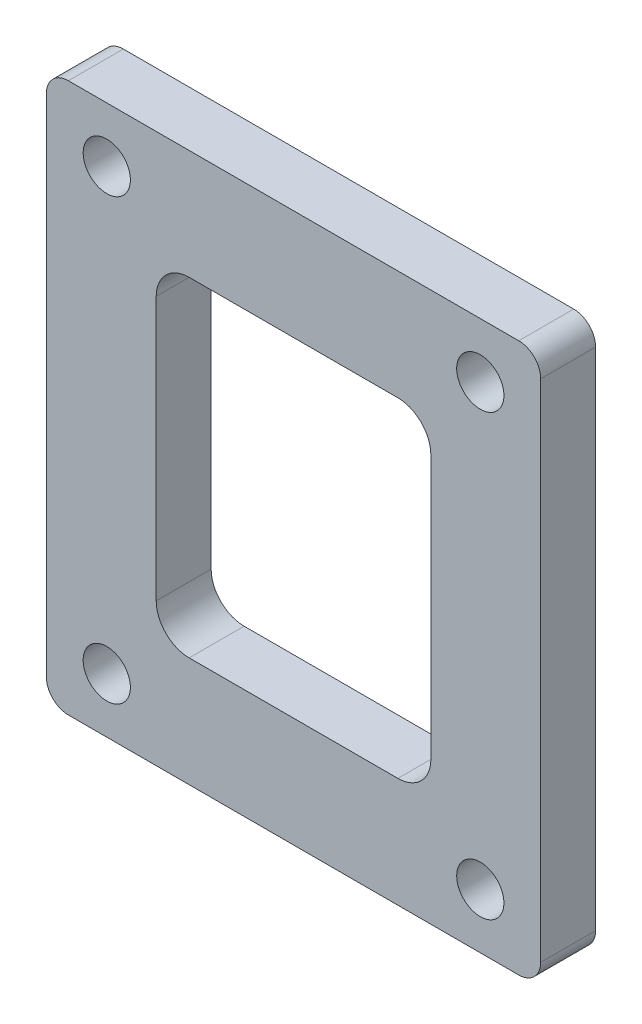
ISO-10303-21;
HEADER;
FILE_DESCRIPTION(('STEP AP214'),'2;1');
FILE_NAME('part.step','',(''),(''),'','','');
FILE_SCHEMA(('AUTOMOTIVE_DESIGN { 1 0 10303 214 1 1 1 1 }'));
ENDSEC;
DATA;
#1=APPLICATION_CONTEXT('core data for automotive mechanical design processes');
#2=APPLICATION_PROTOCOL_DEFINITION('international standard','automotive_design',2000,#1);
#3=PRODUCT_CONTEXT('',#1,'mechanical');
#4=PRODUCT('Part','Part','',(#3));
#5=PRODUCT_RELATED_PRODUCT_CATEGORY('part','',(#4));
#6=PRODUCT_DEFINITION_FORMATION('','',#4);
#7=PRODUCT_DEFINITION_CONTEXT('part definition',#1,'design');
#8=PRODUCT_DEFINITION('design','',#6,#7);
#9=PRODUCT_DEFINITION_SHAPE('','',#8);
#10=(LENGTH_UNIT() NAMED_UNIT(*) SI_UNIT(.MILLI.,.METRE.));
#11=(NAMED_UNIT(*) PLANE_ANGLE_UNIT() SI_UNIT($,.RADIAN.));
#12=(NAMED_UNIT(*) SI_UNIT($,.STERADIAN.) SOLID_ANGLE_UNIT());
#13=UNCERTAINTY_MEASURE_WITH_UNIT(LENGTH_MEASURE(1.E-05),#10,'distance_accuracy_value','');
#14=(GEOMETRIC_REPRESENTATION_CONTEXT(3) GLOBAL_UNCERTAINTY_ASSIGNED_CONTEXT((#13)) GLOBAL_UNIT_ASSIGNED_CONTEXT((#10,
#11,#12)) REPRESENTATION_CONTEXT('',''));
#15=CARTESIAN_POINT('',(0.,0.,0.));
#16=DIRECTION('',(0.,0.,1.));
#17=DIRECTION('',(1.,0.,0.));
#18=AXIS2_PLACEMENT_3D('',#15,#16,#17);
#19=CARTESIAN_POINT('',(0.,0.,5.));
#20=DIRECTION('',(0.,0.,-1.));
#21=DIRECTION('',(-1.,0.,0.));
#22=AXIS2_PLACEMENT_3D('',#19,#20,#21);
#23=PLANE('',#22);
#24=CARTESIAN_POINT('',(39.5,45.,5.));
#25=DIRECTION('',(0.,0.,1.));
#26=DIRECTION('',(1.,0.,0.));
#27=AXIS2_PLACEMENT_3D('',#24,#25,#26);
#28=CIRCLE('',#27,2.14999999999999);
#29=CARTESIAN_POINT('',(41.65,45.,5.));
#30=VERTEX_POINT('',#29);
#31=EDGE_CURVE('E275',#30,#30,#28,.T.);
#32=ORIENTED_EDGE('',*,*,#31,.F.);
#33=EDGE_LOOP('',(#32));
#34=FACE_BOUND('',#33,.T.);
#35=CARTESIAN_POINT('',(39.5,5.,5.));
#36=DIRECTION('',(0.,0.,1.));
#37=DIRECTION('',(-1.,0.,0.));
#38=AXIS2_PLACEMENT_3D('',#35,#36,#37);
#39=CIRCLE('',#38,2.14999999999999);
#40=CARTESIAN_POINT('',(37.35,5.,5.));
#41=VERTEX_POINT('',#40);
#42=EDGE_CURVE('E281',#41,#41,#39,.T.);
#43=ORIENTED_EDGE('',*,*,#42,.F.);
#44=EDGE_LOOP('',(#43));
#45=FACE_BOUND('',#44,.T.);
#46=CARTESIAN_POINT('',(5.5,45.,5.));
#47=DIRECTION('',(0.,0.,1.));
#48=DIRECTION('',(-1.,0.,0.));
#49=AXIS2_PLACEMENT_3D('',#46,#47,#48);
#50=CIRCLE('',#49,2.15);
#51=CARTESIAN_POINT('',(3.35,45.,5.));
#52=VERTEX_POINT('',#51);
#53=EDGE_CURVE('E287',#52,#52,#50,.T.);
#54=ORIENTED_EDGE('',*,*,#53,.F.);
#55=EDGE_LOOP('',(#54));
#56=FACE_BOUND('',#55,.T.);
#57=CARTESIAN_POINT('',(5.5,5.,5.));
#58=DIRECTION('',(0.,0.,1.));
#59=DIRECTION('',(1.,0.,0.));
#60=AXIS2_PLACEMENT_3D('',#57,#58,#59);
#61=CIRCLE('',#60,2.15);
#62=CARTESIAN_POINT('',(7.65,5.,5.));
#63=VERTEX_POINT('',#62);
#64=EDGE_CURVE('E293',#63,#63,#61,.T.);
#65=ORIENTED_EDGE('',*,*,#64,.F.);
#66=EDGE_LOOP('',(#65));
#67=FACE_BOUND('',#66,.T.);
#68=DIRECTION('',(1.,0.,0.));
#69=VECTOR('',#68,1.);
#70=CARTESIAN_POINT('',(0.,0.,5.));
#71=LINE('',#70,#69);
#72=CARTESIAN_POINT('',(2.,0.,5.));
#73=VERTEX_POINT('',#72);
#74=CARTESIAN_POINT('',(43.,0.,5.));
#75=VERTEX_POINT('',#74);
#76=EDGE_CURVE('E300',#73,#75,#71,.T.);
#77=ORIENTED_EDGE('',*,*,#76,.T.);
#78=CARTESIAN_POINT('',(43.,2.,5.));
#79=DIRECTION('',(0.,0.,-1.));
#80=DIRECTION('',(-1.,0.,0.));
#81=AXIS2_PLACEMENT_3D('',#78,#79,#80);
#82=CIRCLE('',#81,2.);
#83=CARTESIAN_POINT('',(45.,2.,5.));
#84=VERTEX_POINT('',#83);
#85=EDGE_CURVE('E198',#75,#84,#82,.F.);
#86=ORIENTED_EDGE('',*,*,#85,.T.);
#87=DIRECTION('',(0.,1.,0.));
#88=VECTOR('',#87,1.);
#89=CARTESIAN_POINT('',(45.,0.,5.));
#90=LINE('',#89,#88);
#91=CARTESIAN_POINT('',(45.,48.,5.));
#92=VERTEX_POINT('',#91);
#93=EDGE_CURVE('E166',#84,#92,#90,.T.);
#94=ORIENTED_EDGE('',*,*,#93,.T.);
#95=CARTESIAN_POINT('',(43.,48.,5.));
#96=DIRECTION('',(0.,0.,-1.));
#97=DIRECTION('',(-1.,0.,0.));
#98=AXIS2_PLACEMENT_3D('',#95,#96,#97);
#99=CIRCLE('',#98,2.);
#100=CARTESIAN_POINT('',(43.,50.,5.));
#101=VERTEX_POINT('',#100);
#102=EDGE_CURVE('E194',#92,#101,#99,.F.);
#103=ORIENTED_EDGE('',*,*,#102,.T.);
#104=DIRECTION('',(-1.,0.,0.));
#105=VECTOR('',#104,1.);
#106=CARTESIAN_POINT('',(0.,50.,5.));
#107=LINE('',#106,#105);
#108=CARTESIAN_POINT('',(2.,50.,5.));
#109=VERTEX_POINT('',#108);
#110=EDGE_CURVE('E184',#101,#109,#107,.T.);
#111=ORIENTED_EDGE('',*,*,#110,.T.);
#112=CARTESIAN_POINT('',(2.,48.,5.));
#113=DIRECTION('',(0.,0.,-1.));
#114=DIRECTION('',(-1.,0.,0.));
#115=AXIS2_PLACEMENT_3D('',#112,#113,#114);
#116=CIRCLE('',#115,2.);
#117=CARTESIAN_POINT('',(0.,48.,5.));
#118=VERTEX_POINT('',#117);
#119=EDGE_CURVE('E192',#109,#118,#116,.F.);
#120=ORIENTED_EDGE('',*,*,#119,.T.);
#121=DIRECTION('',(0.,-1.,0.));
#122=VECTOR('',#121,1.);
#123=CARTESIAN_POINT('',(0.,0.,5.));
#124=LINE('',#123,#122);
#125=CARTESIAN_POINT('',(0.,2.,5.));
#126=VERTEX_POINT('',#125);
#127=EDGE_CURVE('E178',#118,#126,#124,.T.);
#128=ORIENTED_EDGE('',*,*,#127,.T.);
#129=CARTESIAN_POINT('',(2.,2.,5.));
#130=DIRECTION('',(0.,0.,-1.));
#131=DIRECTION('',(-1.,0.,0.));
#132=AXIS2_PLACEMENT_3D('',#129,#130,#131);
#133=CIRCLE('',#132,2.);
#134=EDGE_CURVE('E196',#126,#73,#133,.F.);
#135=ORIENTED_EDGE('',*,*,#134,.T.);
#136=EDGE_LOOP('',(#77,#86,#94,#103,#111,#120,#128,#135));
#137=FACE_BOUND('',#136,.T.);
#138=DIRECTION('',(0.,1.,0.));
#139=VECTOR('',#138,1.);
#140=CARTESIAN_POINT('',(35.,10.,5.));
#141=LINE('',#140,#139);
#142=CARTESIAN_POINT('',(35.,13.,5.));
#143=VERTEX_POINT('',#142);
#144=CARTESIAN_POINT('',(35.,37.,5.));
#145=VERTEX_POINT('',#144);
#146=EDGE_CURVE('E259',#143,#145,#141,.T.);
#147=ORIENTED_EDGE('',*,*,#146,.F.);
#148=CARTESIAN_POINT('',(32.,13.,5.));
#149=DIRECTION('',(0.,0.,-1.));
#150=DIRECTION('',(-1.,0.,0.));
#151=AXIS2_PLACEMENT_3D('',#148,#149,#150);
#152=CIRCLE('',#151,3.);
#153=CARTESIAN_POINT('',(32.,10.,5.));
#154=VERTEX_POINT('',#153);
#155=EDGE_CURVE('E235',#143,#154,#152,.T.);
#156=ORIENTED_EDGE('',*,*,#155,.T.);
#157=DIRECTION('',(1.,0.,0.));
#158=VECTOR('',#157,1.);
#159=CARTESIAN_POINT('',(9.99999999999999,10.,5.));
#160=LINE('',#159,#158);
#161=CARTESIAN_POINT('',(13.,10.,5.));
#162=VERTEX_POINT('',#161);
#163=EDGE_CURVE('E261',#162,#154,#160,.T.);
#164=ORIENTED_EDGE('',*,*,#163,.F.);
#165=CARTESIAN_POINT('',(13.,13.,5.));
#166=DIRECTION('',(0.,0.,-1.));
#167=DIRECTION('',(-1.,0.,0.));
#168=AXIS2_PLACEMENT_3D('',#165,#166,#167);
#169=CIRCLE('',#168,3.);
#170=CARTESIAN_POINT('',(9.99999999999999,13.,5.));
#171=VERTEX_POINT('',#170);
#172=EDGE_CURVE('E231',#162,#171,#169,.T.);
#173=ORIENTED_EDGE('',*,*,#172,.T.);
#174=DIRECTION('',(0.,-1.,0.));
#175=VECTOR('',#174,1.);
#176=CARTESIAN_POINT('',(9.99999999999999,10.,5.));
#177=LINE('',#176,#175);
#178=CARTESIAN_POINT('',(9.99999999999999,37.,5.));
#179=VERTEX_POINT('',#178);
#180=EDGE_CURVE('E258',#179,#171,#177,.T.);
#181=ORIENTED_EDGE('',*,*,#180,.F.);
#182=CARTESIAN_POINT('',(13.,37.,5.));
#183=DIRECTION('',(0.,0.,-1.));
#184=DIRECTION('',(-1.,0.,0.));
#185=AXIS2_PLACEMENT_3D('',#182,#183,#184);
#186=CIRCLE('',#185,3.);
#187=CARTESIAN_POINT('',(13.,40.,5.));
#188=VERTEX_POINT('',#187);
#189=EDGE_CURVE('E11',#179,#188,#186,.T.);
#190=ORIENTED_EDGE('',*,*,#189,.T.);
#191=DIRECTION('',(-1.,0.,0.));
#192=VECTOR('',#191,1.);
#193=CARTESIAN_POINT('',(9.99999999999999,40.,5.));
#194=LINE('',#193,#192);
#195=CARTESIAN_POINT('',(32.,40.,5.));
#196=VERTEX_POINT('',#195);
#197=EDGE_CURVE('E256',#196,#188,#194,.T.);
#198=ORIENTED_EDGE('',*,*,#197,.F.);
#199=CARTESIAN_POINT('',(32.,37.,5.));
#200=DIRECTION('',(0.,0.,-1.));
#201=DIRECTION('',(-1.,0.,0.));
#202=AXIS2_PLACEMENT_3D('',#199,#200,#201);
#203=CIRCLE('',#202,3.);
#204=EDGE_CURVE('E239',#196,#145,#203,.T.);
#205=ORIENTED_EDGE('',*,*,#204,.T.);
#206=EDGE_LOOP('',(#147,#156,#164,#173,#181,#190,#198,#205));
#207=FACE_BOUND('',#206,.T.);
#208=ADVANCED_FACE('F33',(#34,#45,#56,#67,#137,#207),#23,.F.);
#209=CARTESIAN_POINT('',(0.,0.,0.));
#210=DIRECTION('',(0.,0.,-1.));
#211=DIRECTION('',(-1.,0.,0.));
#212=AXIS2_PLACEMENT_3D('',#209,#210,#211);
#213=PLANE('',#212);
#214=CARTESIAN_POINT('',(39.5,5.,0.));
#215=DIRECTION('',(0.,0.,1.));
#216=DIRECTION('',(-1.,0.,0.));
#217=AXIS2_PLACEMENT_3D('',#214,#215,#216);
#218=CIRCLE('',#217,2.14999999999999);
#219=CARTESIAN_POINT('',(37.35,5.,0.));
#220=VERTEX_POINT('',#219);
#221=EDGE_CURVE('E278',#220,#220,#218,.T.);
#222=ORIENTED_EDGE('',*,*,#221,.T.);
#223=EDGE_LOOP('',(#222));
#224=FACE_BOUND('',#223,.T.);
#225=CARTESIAN_POINT('',(5.5,5.,0.));
#226=DIRECTION('',(0.,0.,1.));
#227=DIRECTION('',(1.,0.,0.));
#228=AXIS2_PLACEMENT_3D('',#225,#226,#227);
#229=CIRCLE('',#228,2.15);
#230=CARTESIAN_POINT('',(7.65,5.,0.));
#231=VERTEX_POINT('',#230);
#232=EDGE_CURVE('E290',#231,#231,#229,.T.);
#233=ORIENTED_EDGE('',*,*,#232,.T.);
#234=EDGE_LOOP('',(#233));
#235=FACE_BOUND('',#234,.T.);
#236=DIRECTION('',(0.,1.,0.));
#237=VECTOR('',#236,1.);
#238=CARTESIAN_POINT('',(45.,0.,0.));
#239=LINE('',#238,#237);
#240=CARTESIAN_POINT('',(45.,2.,0.));
#241=VERTEX_POINT('',#240);
#242=CARTESIAN_POINT('',(45.,48.,0.));
#243=VERTEX_POINT('',#242);
#244=EDGE_CURVE('E163',#241,#243,#239,.T.);
#245=ORIENTED_EDGE('',*,*,#244,.F.);
#246=CARTESIAN_POINT('',(43.,2.,0.));
#247=DIRECTION('',(0.,0.,-1.));
#248=DIRECTION('',(-1.,0.,0.));
#249=AXIS2_PLACEMENT_3D('',#246,#247,#248);
#250=CIRCLE('',#249,2.);
#251=CARTESIAN_POINT('',(43.,0.,0.));
#252=VERTEX_POINT('',#251);
#253=EDGE_CURVE('E146',#241,#252,#250,.T.);
#254=ORIENTED_EDGE('',*,*,#253,.T.);
#255=DIRECTION('',(1.,0.,0.));
#256=VECTOR('',#255,1.);
#257=CARTESIAN_POINT('',(0.,0.,0.));
#258=LINE('',#257,#256);
#259=CARTESIAN_POINT('',(2.,0.,0.));
#260=VERTEX_POINT('',#259);
#261=EDGE_CURVE('E175',#260,#252,#258,.T.);
#262=ORIENTED_EDGE('',*,*,#261,.F.);
#263=CARTESIAN_POINT('',(2.,2.,0.));
#264=DIRECTION('',(0.,0.,-1.));
#265=DIRECTION('',(-1.,0.,0.));
#266=AXIS2_PLACEMENT_3D('',#263,#264,#265);
#267=CIRCLE('',#266,2.);
#268=CARTESIAN_POINT('',(0.,2.,0.));
#269=VERTEX_POINT('',#268);
#270=EDGE_CURVE('E157',#260,#269,#267,.T.);
#271=ORIENTED_EDGE('',*,*,#270,.T.);
#272=DIRECTION('',(0.,-1.,0.));
#273=VECTOR('',#272,1.);
#274=CARTESIAN_POINT('',(0.,0.,0.));
#275=LINE('',#274,#273);
#276=CARTESIAN_POINT('',(0.,48.,0.));
#277=VERTEX_POINT('',#276);
#278=EDGE_CURVE('E180',#277,#269,#275,.T.);
#279=ORIENTED_EDGE('',*,*,#278,.F.);
#280=CARTESIAN_POINT('',(2.,48.,0.));
#281=DIRECTION('',(0.,0.,-1.));
#282=DIRECTION('',(-1.,0.,0.));
#283=AXIS2_PLACEMENT_3D('',#280,#281,#282);
#284=CIRCLE('',#283,2.);
#285=CARTESIAN_POINT('',(2.,50.,0.));
#286=VERTEX_POINT('',#285);
#287=EDGE_CURVE('E167',#277,#286,#284,.T.);
#288=ORIENTED_EDGE('',*,*,#287,.T.);
#289=DIRECTION('',(-1.,0.,0.));
#290=VECTOR('',#289,1.);
#291=CARTESIAN_POINT('',(0.,50.,0.));
#292=LINE('',#291,#290);
#293=CARTESIAN_POINT('',(43.,50.,0.));
#294=VERTEX_POINT('',#293);
#295=EDGE_CURVE('E174',#294,#286,#292,.T.);
#296=ORIENTED_EDGE('',*,*,#295,.F.);
#297=CARTESIAN_POINT('',(43.,48.,0.));
#298=DIRECTION('',(0.,0.,-1.));
#299=DIRECTION('',(-1.,0.,0.));
#300=AXIS2_PLACEMENT_3D('',#297,#298,#299);
#301=CIRCLE('',#300,2.);
#302=EDGE_CURVE('E173',#294,#243,#301,.T.);
#303=ORIENTED_EDGE('',*,*,#302,.T.);
#304=EDGE_LOOP('',(#245,#254,#262,#271,#279,#288,#296,#303));
#305=FACE_BOUND('',#304,.T.);
#306=CARTESIAN_POINT('',(5.5,45.,0.));
#307=DIRECTION('',(0.,0.,1.));
#308=DIRECTION('',(-1.,0.,0.));
#309=AXIS2_PLACEMENT_3D('',#306,#307,#308);
#310=CIRCLE('',#309,2.15);
#311=CARTESIAN_POINT('',(3.35,45.,0.));
#312=VERTEX_POINT('',#311);
#313=EDGE_CURVE('E284',#312,#312,#310,.T.);
#314=ORIENTED_EDGE('',*,*,#313,.T.);
#315=EDGE_LOOP('',(#314));
#316=FACE_BOUND('',#315,.T.);
#317=CARTESIAN_POINT('',(39.5,45.,0.));
#318=DIRECTION('',(0.,0.,1.));
#319=DIRECTION('',(1.,0.,0.));
#320=AXIS2_PLACEMENT_3D('',#317,#318,#319);
#321=CIRCLE('',#320,2.14999999999999);
#322=CARTESIAN_POINT('',(41.65,45.,0.));
#323=VERTEX_POINT('',#322);
#324=EDGE_CURVE('E268',#323,#323,#321,.T.);
#325=ORIENTED_EDGE('',*,*,#324,.T.);
#326=EDGE_LOOP('',(#325));
#327=FACE_BOUND('',#326,.T.);
#328=DIRECTION('',(0.,-1.,0.));
#329=VECTOR('',#328,1.);
#330=CARTESIAN_POINT('',(9.99999999999999,10.,0.));
#331=LINE('',#330,#329);
#332=CARTESIAN_POINT('',(9.99999999999999,37.,0.));
#333=VERTEX_POINT('',#332);
#334=CARTESIAN_POINT('',(9.99999999999999,13.,0.));
#335=VERTEX_POINT('',#334);
#336=EDGE_CURVE('E244',#333,#335,#331,.T.);
#337=ORIENTED_EDGE('',*,*,#336,.T.);
#338=CARTESIAN_POINT('',(13.,13.,0.));
#339=DIRECTION('',(0.,0.,-1.));
#340=DIRECTION('',(-1.,0.,0.));
#341=AXIS2_PLACEMENT_3D('',#338,#339,#340);
#342=CIRCLE('',#341,3.);
#343=CARTESIAN_POINT('',(13.,10.,0.));
#344=VERTEX_POINT('',#343);
#345=EDGE_CURVE('E229',#335,#344,#342,.F.);
#346=ORIENTED_EDGE('',*,*,#345,.T.);
#347=DIRECTION('',(1.,0.,0.));
#348=VECTOR('',#347,1.);
#349=CARTESIAN_POINT('',(9.99999999999999,10.,0.));
#350=LINE('',#349,#348);
#351=CARTESIAN_POINT('',(32.,10.,0.));
#352=VERTEX_POINT('',#351);
#353=EDGE_CURVE('E253',#344,#352,#350,.T.);
#354=ORIENTED_EDGE('',*,*,#353,.T.);
#355=CARTESIAN_POINT('',(32.,13.,0.));
#356=DIRECTION('',(0.,0.,-1.));
#357=DIRECTION('',(-1.,0.,0.));
#358=AXIS2_PLACEMENT_3D('',#355,#356,#357);
#359=CIRCLE('',#358,3.);
#360=CARTESIAN_POINT('',(35.,13.,0.));
#361=VERTEX_POINT('',#360);
#362=EDGE_CURVE('E233',#352,#361,#359,.F.);
#363=ORIENTED_EDGE('',*,*,#362,.T.);
#364=DIRECTION('',(0.,1.,0.));
#365=VECTOR('',#364,1.);
#366=CARTESIAN_POINT('',(35.,10.,0.));
#367=LINE('',#366,#365);
#368=CARTESIAN_POINT('',(35.,37.,0.));
#369=VERTEX_POINT('',#368);
#370=EDGE_CURVE('E269',#361,#369,#367,.T.);
#371=ORIENTED_EDGE('',*,*,#370,.T.);
#372=CARTESIAN_POINT('',(32.,37.,0.));
#373=DIRECTION('',(0.,0.,-1.));
#374=DIRECTION('',(-1.,0.,0.));
#375=AXIS2_PLACEMENT_3D('',#372,#373,#374);
#376=CIRCLE('',#375,3.);
#377=CARTESIAN_POINT('',(32.,40.,0.));
#378=VERTEX_POINT('',#377);
#379=EDGE_CURVE('E237',#369,#378,#376,.F.);
#380=ORIENTED_EDGE('',*,*,#379,.T.);
#381=DIRECTION('',(-1.,0.,0.));
#382=VECTOR('',#381,1.);
#383=CARTESIAN_POINT('',(9.99999999999999,40.,0.));
#384=LINE('',#383,#382);
#385=CARTESIAN_POINT('',(13.,40.,0.));
#386=VERTEX_POINT('',#385);
#387=EDGE_CURVE('E245',#378,#386,#384,.T.);
#388=ORIENTED_EDGE('',*,*,#387,.T.);
#389=CARTESIAN_POINT('',(13.,37.,0.));
#390=DIRECTION('',(0.,0.,-1.));
#391=DIRECTION('',(-1.,0.,0.));
#392=AXIS2_PLACEMENT_3D('',#389,#390,#391);
#393=CIRCLE('',#392,3.);
#394=EDGE_CURVE('E41',#386,#333,#393,.F.);
#395=ORIENTED_EDGE('',*,*,#394,.T.);
#396=EDGE_LOOP('',(#337,#346,#354,#363,#371,#380,#388,#395));
#397=FACE_BOUND('',#396,.T.);
#398=ADVANCED_FACE('F170',(#224,#235,#305,#316,#327,#397),#213,.T.);
#399=CARTESIAN_POINT('',(0.,0.,5.));
#400=DIRECTION('',(1.,0.,0.));
#401=DIRECTION('',(0.,0.,-1.));
#402=AXIS2_PLACEMENT_3D('',#399,#400,#401);
#403=PLANE('',#402);
#404=ORIENTED_EDGE('',*,*,#278,.T.);
#405=DIRECTION('',(0.,0.,-1.));
#406=VECTOR('',#405,1.);
#407=CARTESIAN_POINT('',(0.,2.,5.));
#408=LINE('',#407,#406);
#409=EDGE_CURVE('E203',#269,#126,#408,.F.);
#410=ORIENTED_EDGE('',*,*,#409,.T.);
#411=ORIENTED_EDGE('',*,*,#127,.F.);
#412=DIRECTION('',(0.,0.,-1.));
#413=VECTOR('',#412,1.);
#414=CARTESIAN_POINT('',(0.,48.,5.));
#415=LINE('',#414,#413);
#416=EDGE_CURVE('E200',#118,#277,#415,.T.);
#417=ORIENTED_EDGE('',*,*,#416,.T.);
#418=EDGE_LOOP('',(#404,#410,#411,#417));
#419=FACE_BOUND('',#418,.T.);
#420=ADVANCED_FACE('F309',(#419),#403,.F.);
#421=CARTESIAN_POINT('',(0.,0.,5.));
#422=DIRECTION('',(0.,1.,0.));
#423=DIRECTION('',(0.,0.,1.));
#424=AXIS2_PLACEMENT_3D('',#421,#422,#423);
#425=PLANE('',#424);
#426=ORIENTED_EDGE('',*,*,#261,.T.);
#427=DIRECTION('',(0.,0.,-1.));
#428=VECTOR('',#427,1.);
#429=CARTESIAN_POINT('',(43.,0.,5.));
#430=LINE('',#429,#428);
#431=EDGE_CURVE('E151',#252,#75,#430,.F.);
#432=ORIENTED_EDGE('',*,*,#431,.T.);
#433=ORIENTED_EDGE('',*,*,#76,.F.);
#434=DIRECTION('',(0.,0.,-1.));
#435=VECTOR('',#434,1.);
#436=CARTESIAN_POINT('',(2.,0.,5.));
#437=LINE('',#436,#435);
#438=EDGE_CURVE('E156',#73,#260,#437,.T.);
#439=ORIENTED_EDGE('',*,*,#438,.T.);
#440=EDGE_LOOP('',(#426,#432,#433,#439));
#441=FACE_BOUND('',#440,.T.);
#442=ADVANCED_FACE('F319',(#441),#425,.F.);
#443=CARTESIAN_POINT('',(45.,0.,5.));
#444=DIRECTION('',(-1.,0.,0.));
#445=DIRECTION('',(0.,0.,1.));
#446=AXIS2_PLACEMENT_3D('',#443,#444,#445);
#447=PLANE('',#446);
#448=ORIENTED_EDGE('',*,*,#93,.F.);
#449=DIRECTION('',(0.,0.,-1.));
#450=VECTOR('',#449,1.);
#451=CARTESIAN_POINT('',(45.,2.,5.));
#452=LINE('',#451,#450);
#453=EDGE_CURVE('E150',#84,#241,#452,.T.);
#454=ORIENTED_EDGE('',*,*,#453,.T.);
#455=ORIENTED_EDGE('',*,*,#244,.T.);
#456=DIRECTION('',(0.,0.,-1.));
#457=VECTOR('',#456,1.);
#458=CARTESIAN_POINT('',(45.,48.,5.));
#459=LINE('',#458,#457);
#460=EDGE_CURVE('E168',#243,#92,#459,.F.);
#461=ORIENTED_EDGE('',*,*,#460,.T.);
#462=EDGE_LOOP('',(#448,#454,#455,#461));
#463=FACE_BOUND('',#462,.T.);
#464=ADVANCED_FACE('F162',(#463),#447,.F.);
#465=CARTESIAN_POINT('',(0.,50.,5.));
#466=DIRECTION('',(0.,-1.,0.));
#467=DIRECTION('',(0.,0.,-1.));
#468=AXIS2_PLACEMENT_3D('',#465,#466,#467);
#469=PLANE('',#468);
#470=ORIENTED_EDGE('',*,*,#110,.F.);
#471=DIRECTION('',(0.,0.,-1.));
#472=VECTOR('',#471,1.);
#473=CARTESIAN_POINT('',(43.,50.,5.));
#474=LINE('',#473,#472);
#475=EDGE_CURVE('E207',#101,#294,#474,.T.);
#476=ORIENTED_EDGE('',*,*,#475,.T.);
#477=ORIENTED_EDGE('',*,*,#295,.T.);
#478=DIRECTION('',(0.,0.,-1.));
#479=VECTOR('',#478,1.);
#480=CARTESIAN_POINT('',(2.,50.,5.));
#481=LINE('',#480,#479);
#482=EDGE_CURVE('E205',#286,#109,#481,.F.);
#483=ORIENTED_EDGE('',*,*,#482,.T.);
#484=EDGE_LOOP('',(#470,#476,#477,#483));
#485=FACE_BOUND('',#484,.T.);
#486=ADVANCED_FACE('F326',(#485),#469,.F.);
#487=CARTESIAN_POINT('',(5.5,5.,5.));
#488=DIRECTION('',(0.,0.,-1.));
#489=DIRECTION('',(-1.,0.,0.));
#490=AXIS2_PLACEMENT_3D('',#487,#488,#489);
#491=CYLINDRICAL_SURFACE('',#490,2.15);
#492=ORIENTED_EDGE('',*,*,#64,.T.);
#493=EDGE_LOOP('',(#492));
#494=FACE_BOUND('',#493,.T.);
#495=ORIENTED_EDGE('',*,*,#232,.F.);
#496=EDGE_LOOP('',(#495));
#497=FACE_BOUND('',#496,.T.);
#498=ADVANCED_FACE('F340',(#494,#497),#491,.F.);
#499=CARTESIAN_POINT('',(5.5,45.,5.));
#500=DIRECTION('',(0.,0.,-1.));
#501=DIRECTION('',(-1.,0.,0.));
#502=AXIS2_PLACEMENT_3D('',#499,#500,#501);
#503=CYLINDRICAL_SURFACE('',#502,2.15);
#504=ORIENTED_EDGE('',*,*,#53,.T.);
#505=EDGE_LOOP('',(#504));
#506=FACE_BOUND('',#505,.T.);
#507=ORIENTED_EDGE('',*,*,#313,.F.);
#508=EDGE_LOOP('',(#507));
#509=FACE_BOUND('',#508,.T.);
#510=ADVANCED_FACE('F348',(#506,#509),#503,.F.);
#511=CARTESIAN_POINT('',(39.5,5.,5.));
#512=DIRECTION('',(0.,0.,-1.));
#513=DIRECTION('',(-1.,0.,0.));
#514=AXIS2_PLACEMENT_3D('',#511,#512,#513);
#515=CYLINDRICAL_SURFACE('',#514,2.14999999999999);
#516=ORIENTED_EDGE('',*,*,#42,.T.);
#517=EDGE_LOOP('',(#516));
#518=FACE_BOUND('',#517,.T.);
#519=ORIENTED_EDGE('',*,*,#221,.F.);
#520=EDGE_LOOP('',(#519));
#521=FACE_BOUND('',#520,.T.);
#522=ADVANCED_FACE('F411',(#518,#521),#515,.F.);
#523=CARTESIAN_POINT('',(39.5,45.,5.));
#524=DIRECTION('',(0.,0.,-1.));
#525=DIRECTION('',(-1.,0.,0.));
#526=AXIS2_PLACEMENT_3D('',#523,#524,#525);
#527=CYLINDRICAL_SURFACE('',#526,2.14999999999999);
#528=ORIENTED_EDGE('',*,*,#31,.T.);
#529=EDGE_LOOP('',(#528));
#530=FACE_BOUND('',#529,.T.);
#531=ORIENTED_EDGE('',*,*,#324,.F.);
#532=EDGE_LOOP('',(#531));
#533=FACE_BOUND('',#532,.T.);
#534=ADVANCED_FACE('F408',(#530,#533),#527,.F.);
#535=CARTESIAN_POINT('',(35.,10.,5.));
#536=DIRECTION('',(-1.,0.,0.));
#537=DIRECTION('',(0.,0.,1.));
#538=AXIS2_PLACEMENT_3D('',#535,#536,#537);
#539=PLANE('',#538);
#540=ORIENTED_EDGE('',*,*,#370,.F.);
#541=DIRECTION('',(0.,0.,-1.));
#542=VECTOR('',#541,1.);
#543=CARTESIAN_POINT('',(35.,13.,5.));
#544=LINE('',#543,#542);
#545=EDGE_CURVE('E223',#361,#143,#544,.F.);
#546=ORIENTED_EDGE('',*,*,#545,.T.);
#547=ORIENTED_EDGE('',*,*,#146,.T.);
#548=DIRECTION('',(0.,0.,-1.));
#549=VECTOR('',#548,1.);
#550=CARTESIAN_POINT('',(35.,37.,0.));
#551=LINE('',#550,#549);
#552=EDGE_CURVE('E220',#145,#369,#551,.T.);
#553=ORIENTED_EDGE('',*,*,#552,.T.);
#554=EDGE_LOOP('',(#540,#546,#547,#553));
#555=FACE_BOUND('',#554,.T.);
#556=ADVANCED_FACE('F387',(#555),#539,.T.);
#557=CARTESIAN_POINT('',(9.99999999999999,40.,5.));
#558=DIRECTION('',(0.,-1.,0.));
#559=DIRECTION('',(0.,0.,-1.));
#560=AXIS2_PLACEMENT_3D('',#557,#558,#559);
#561=PLANE('',#560);
#562=ORIENTED_EDGE('',*,*,#387,.F.);
#563=DIRECTION('',(0.,0.,-1.));
#564=VECTOR('',#563,1.);
#565=CARTESIAN_POINT('',(32.,40.,5.));
#566=LINE('',#565,#564);
#567=EDGE_CURVE('E53',#378,#196,#566,.F.);
#568=ORIENTED_EDGE('',*,*,#567,.T.);
#569=ORIENTED_EDGE('',*,*,#197,.T.);
#570=DIRECTION('',(0.,0.,-1.));
#571=VECTOR('',#570,1.);
#572=CARTESIAN_POINT('',(13.,40.,0.));
#573=LINE('',#572,#571);
#574=EDGE_CURVE('E225',#188,#386,#573,.T.);
#575=ORIENTED_EDGE('',*,*,#574,.T.);
#576=EDGE_LOOP('',(#562,#568,#569,#575));
#577=FACE_BOUND('',#576,.T.);
#578=ADVANCED_FACE('F255',(#577),#561,.T.);
#579=CARTESIAN_POINT('',(9.99999999999999,10.,5.));
#580=DIRECTION('',(1.,0.,0.));
#581=DIRECTION('',(0.,0.,-1.));
#582=AXIS2_PLACEMENT_3D('',#579,#580,#581);
#583=PLANE('',#582);
#584=ORIENTED_EDGE('',*,*,#180,.T.);
#585=DIRECTION('',(0.,0.,-1.));
#586=VECTOR('',#585,1.);
#587=CARTESIAN_POINT('',(9.99999999999999,13.,0.));
#588=LINE('',#587,#586);
#589=EDGE_CURVE('E212',#171,#335,#588,.T.);
#590=ORIENTED_EDGE('',*,*,#589,.T.);
#591=ORIENTED_EDGE('',*,*,#336,.F.);
#592=DIRECTION('',(0.,0.,-1.));
#593=VECTOR('',#592,1.);
#594=CARTESIAN_POINT('',(9.99999999999999,37.,5.));
#595=LINE('',#594,#593);
#596=EDGE_CURVE('E210',#333,#179,#595,.F.);
#597=ORIENTED_EDGE('',*,*,#596,.T.);
#598=EDGE_LOOP('',(#584,#590,#591,#597));
#599=FACE_BOUND('',#598,.T.);
#600=ADVANCED_FACE('F251',(#599),#583,.T.);
#601=CARTESIAN_POINT('',(9.99999999999999,10.,5.));
#602=DIRECTION('',(0.,1.,0.));
#603=DIRECTION('',(-1.,0.,0.));
#604=AXIS2_PLACEMENT_3D('',#601,#602,#603);
#605=PLANE('',#604);
#606=ORIENTED_EDGE('',*,*,#353,.F.);
#607=DIRECTION('',(0.,0.,-1.));
#608=VECTOR('',#607,1.);
#609=CARTESIAN_POINT('',(13.,10.,5.));
#610=LINE('',#609,#608);
#611=EDGE_CURVE('E218',#344,#162,#610,.F.);
#612=ORIENTED_EDGE('',*,*,#611,.T.);
#613=ORIENTED_EDGE('',*,*,#163,.T.);
#614=DIRECTION('',(0.,0.,-1.));
#615=VECTOR('',#614,1.);
#616=CARTESIAN_POINT('',(32.,10.,0.));
#617=LINE('',#616,#615);
#618=EDGE_CURVE('E215',#154,#352,#617,.T.);
#619=ORIENTED_EDGE('',*,*,#618,.T.);
#620=EDGE_LOOP('',(#606,#612,#613,#619));
#621=FACE_BOUND('',#620,.T.);
#622=ADVANCED_FACE('F394',(#621),#605,.T.);
#623=CARTESIAN_POINT('',(43.,2.,5.));
#624=DIRECTION('',(0.,0.,-1.));
#625=DIRECTION('',(-1.,0.,0.));
#626=AXIS2_PLACEMENT_3D('',#623,#624,#625);
#627=CYLINDRICAL_SURFACE('',#626,2.);
#628=ORIENTED_EDGE('',*,*,#85,.F.);
#629=ORIENTED_EDGE('',*,*,#431,.F.);
#630=ORIENTED_EDGE('',*,*,#253,.F.);
#631=ORIENTED_EDGE('',*,*,#453,.F.);
#632=EDGE_LOOP('',(#628,#629,#630,#631));
#633=FACE_BOUND('',#632,.T.);
#634=ADVANCED_FACE('F149',(#633),#627,.T.);
#635=CARTESIAN_POINT('',(2.,2.,5.));
#636=DIRECTION('',(0.,0.,-1.));
#637=DIRECTION('',(-1.,0.,0.));
#638=AXIS2_PLACEMENT_3D('',#635,#636,#637);
#639=CYLINDRICAL_SURFACE('',#638,2.);
#640=ORIENTED_EDGE('',*,*,#134,.F.);
#641=ORIENTED_EDGE('',*,*,#409,.F.);
#642=ORIENTED_EDGE('',*,*,#270,.F.);
#643=ORIENTED_EDGE('',*,*,#438,.F.);
#644=EDGE_LOOP('',(#640,#641,#642,#643));
#645=FACE_BOUND('',#644,.T.);
#646=ADVANCED_FACE('F314',(#645),#639,.T.);
#647=CARTESIAN_POINT('',(43.,48.,5.));
#648=DIRECTION('',(0.,0.,-1.));
#649=DIRECTION('',(-1.,0.,0.));
#650=AXIS2_PLACEMENT_3D('',#647,#648,#649);
#651=CYLINDRICAL_SURFACE('',#650,2.);
#652=ORIENTED_EDGE('',*,*,#102,.F.);
#653=ORIENTED_EDGE('',*,*,#460,.F.);
#654=ORIENTED_EDGE('',*,*,#302,.F.);
#655=ORIENTED_EDGE('',*,*,#475,.F.);
#656=EDGE_LOOP('',(#652,#653,#654,#655));
#657=FACE_BOUND('',#656,.T.);
#658=ADVANCED_FACE('F356',(#657),#651,.T.);
#659=CARTESIAN_POINT('',(2.,48.,5.));
#660=DIRECTION('',(0.,0.,-1.));
#661=DIRECTION('',(-1.,0.,0.));
#662=AXIS2_PLACEMENT_3D('',#659,#660,#661);
#663=CYLINDRICAL_SURFACE('',#662,2.);
#664=ORIENTED_EDGE('',*,*,#119,.F.);
#665=ORIENTED_EDGE('',*,*,#482,.F.);
#666=ORIENTED_EDGE('',*,*,#287,.F.);
#667=ORIENTED_EDGE('',*,*,#416,.F.);
#668=EDGE_LOOP('',(#664,#665,#666,#667));
#669=FACE_BOUND('',#668,.T.);
#670=ADVANCED_FACE('F358',(#669),#663,.T.);
#671=CARTESIAN_POINT('',(13.,13.,5.));
#672=DIRECTION('',(0.,0.,1.));
#673=DIRECTION('',(1.,0.,0.));
#674=AXIS2_PLACEMENT_3D('',#671,#672,#673);
#675=CYLINDRICAL_SURFACE('',#674,3.);
#676=ORIENTED_EDGE('',*,*,#172,.F.);
#677=ORIENTED_EDGE('',*,*,#611,.F.);
#678=ORIENTED_EDGE('',*,*,#345,.F.);
#679=ORIENTED_EDGE('',*,*,#589,.F.);
#680=EDGE_LOOP('',(#676,#677,#678,#679));
#681=FACE_BOUND('',#680,.T.);
#682=ADVANCED_FACE('F364',(#681),#675,.F.);
#683=CARTESIAN_POINT('',(32.,13.,5.));
#684=DIRECTION('',(0.,0.,1.));
#685=DIRECTION('',(1.,0.,0.));
#686=AXIS2_PLACEMENT_3D('',#683,#684,#685);
#687=CYLINDRICAL_SURFACE('',#686,3.);
#688=ORIENTED_EDGE('',*,*,#155,.F.);
#689=ORIENTED_EDGE('',*,*,#545,.F.);
#690=ORIENTED_EDGE('',*,*,#362,.F.);
#691=ORIENTED_EDGE('',*,*,#618,.F.);
#692=EDGE_LOOP('',(#688,#689,#690,#691));
#693=FACE_BOUND('',#692,.T.);
#694=ADVANCED_FACE('F372',(#693),#687,.F.);
#695=CARTESIAN_POINT('',(32.,37.,5.));
#696=DIRECTION('',(0.,0.,1.));
#697=DIRECTION('',(1.,0.,0.));
#698=AXIS2_PLACEMENT_3D('',#695,#696,#697);
#699=CYLINDRICAL_SURFACE('',#698,3.);
#700=ORIENTED_EDGE('',*,*,#204,.F.);
#701=ORIENTED_EDGE('',*,*,#567,.F.);
#702=ORIENTED_EDGE('',*,*,#379,.F.);
#703=ORIENTED_EDGE('',*,*,#552,.F.);
#704=EDGE_LOOP('',(#700,#701,#702,#703));
#705=FACE_BOUND('',#704,.T.);
#706=ADVANCED_FACE('F375',(#705),#699,.F.);
#707=CARTESIAN_POINT('',(13.,37.,5.));
#708=DIRECTION('',(0.,0.,1.));
#709=DIRECTION('',(1.,0.,0.));
#710=AXIS2_PLACEMENT_3D('',#707,#708,#709);
#711=CYLINDRICAL_SURFACE('',#710,3.);
#712=ORIENTED_EDGE('',*,*,#189,.F.);
#713=ORIENTED_EDGE('',*,*,#596,.F.);
#714=ORIENTED_EDGE('',*,*,#394,.F.);
#715=ORIENTED_EDGE('',*,*,#574,.F.);
#716=EDGE_LOOP('',(#712,#713,#714,#715));
#717=FACE_BOUND('',#716,.T.);
#718=ADVANCED_FACE('F35',(#717),#711,.F.);
#719=CLOSED_SHELL('',(#208,#398,#420,#442,#464,#486,#498,#510,#522,#534,#556,#578,#600,#622,
#634,#646,#658,#670,#682,#694,#706,#718));
#720=MANIFOLD_SOLID_BREP('B2',#719);
#721=ADVANCED_BREP_SHAPE_REPRESENTATION('',(#18,#720),#14);
#722=SHAPE_DEFINITION_REPRESENTATION(#9,#721);
ENDSEC;
END-ISO-10303-21;
